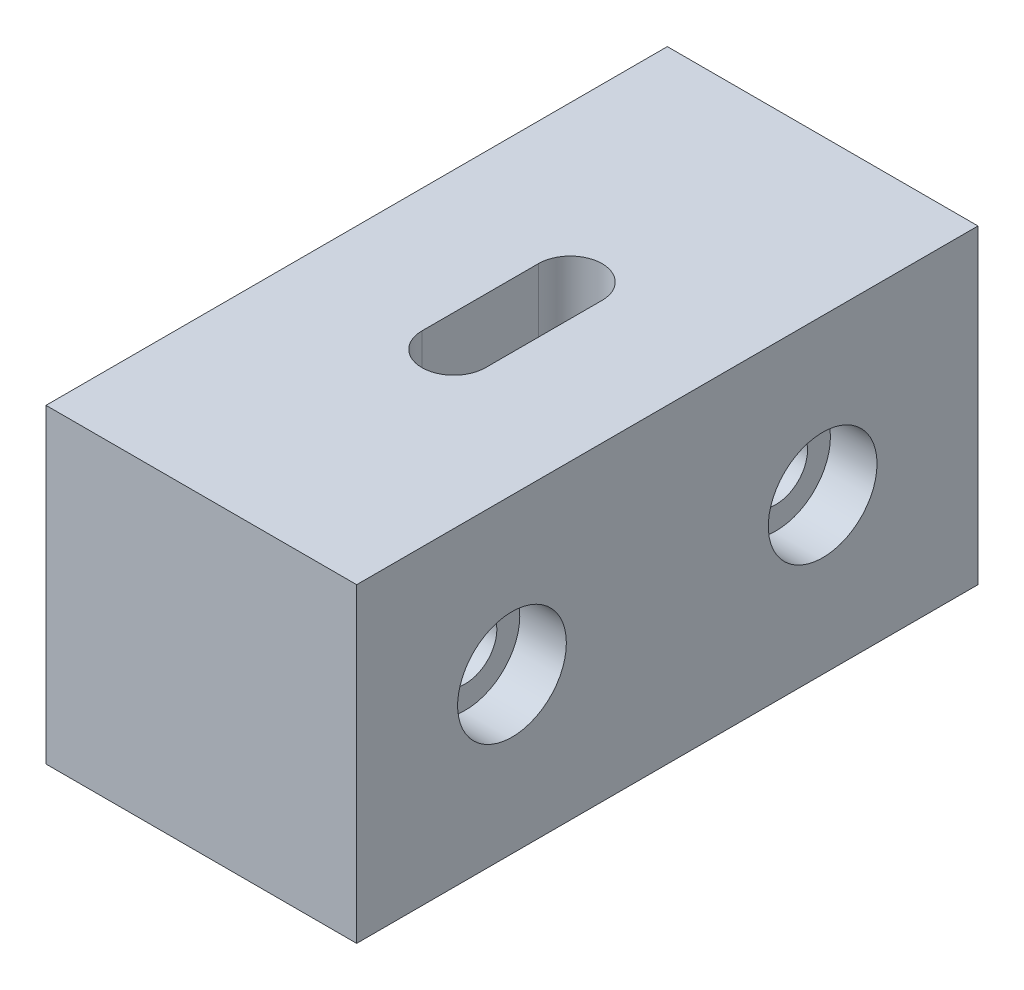
ISO-10303-21;
HEADER;
FILE_DESCRIPTION(('STEP AP214'),'2;1');
FILE_NAME('part.step','',(''),(''),'','','');
FILE_SCHEMA(('AUTOMOTIVE_DESIGN { 1 0 10303 214 1 1 1 1 }'));
ENDSEC;
DATA;
#1=APPLICATION_CONTEXT('core data for automotive mechanical design processes');
#2=APPLICATION_PROTOCOL_DEFINITION('international standard','automotive_design',2000,#1);
#3=PRODUCT_CONTEXT('',#1,'mechanical');
#4=PRODUCT('Part','Part','',(#3));
#5=PRODUCT_RELATED_PRODUCT_CATEGORY('part','',(#4));
#6=PRODUCT_DEFINITION_FORMATION('','',#4);
#7=PRODUCT_DEFINITION_CONTEXT('part definition',#1,'design');
#8=PRODUCT_DEFINITION('design','',#6,#7);
#9=PRODUCT_DEFINITION_SHAPE('','',#8);
#10=(LENGTH_UNIT() NAMED_UNIT(*) SI_UNIT(.MILLI.,.METRE.));
#11=(NAMED_UNIT(*) PLANE_ANGLE_UNIT() SI_UNIT($,.RADIAN.));
#12=(NAMED_UNIT(*) SI_UNIT($,.STERADIAN.) SOLID_ANGLE_UNIT());
#13=UNCERTAINTY_MEASURE_WITH_UNIT(LENGTH_MEASURE(1.E-05),#10,'distance_accuracy_value','');
#14=(GEOMETRIC_REPRESENTATION_CONTEXT(3) GLOBAL_UNCERTAINTY_ASSIGNED_CONTEXT((#13)) GLOBAL_UNIT_ASSIGNED_CONTEXT((#10,
#11,#12)) REPRESENTATION_CONTEXT('',''));
#15=CARTESIAN_POINT('',(0.,0.,0.));
#16=DIRECTION('',(0.,0.,1.));
#17=DIRECTION('',(1.,0.,0.));
#18=AXIS2_PLACEMENT_3D('',#15,#16,#17);
#19=CARTESIAN_POINT('',(0.,-20.,-40.));
#20=DIRECTION('',(0.,-1.,0.));
#21=DIRECTION('',(0.,0.,-1.));
#22=AXIS2_PLACEMENT_3D('',#19,#20,#21);
#23=PLANE('',#22);
#24=DIRECTION('',(0.,0.,1.));
#25=VECTOR('',#24,1.);
#26=CARTESIAN_POINT('',(20.,-20.,-40.));
#27=LINE('',#26,#25);
#28=CARTESIAN_POINT('',(20.,-20.,-40.));
#29=VERTEX_POINT('',#28);
#30=CARTESIAN_POINT('',(20.,-20.,40.));
#31=VERTEX_POINT('',#30);
#32=EDGE_CURVE('E162',#29,#31,#27,.T.);
#33=ORIENTED_EDGE('',*,*,#32,.T.);
#34=DIRECTION('',(1.,0.,0.));
#35=VECTOR('',#34,1.);
#36=CARTESIAN_POINT('',(0.,-20.,40.));
#37=LINE('',#36,#35);
#38=CARTESIAN_POINT('',(-20.,-20.,40.));
#39=VERTEX_POINT('',#38);
#40=EDGE_CURVE('E140',#39,#31,#37,.T.);
#41=ORIENTED_EDGE('',*,*,#40,.F.);
#42=DIRECTION('',(0.,0.,1.));
#43=VECTOR('',#42,1.);
#44=CARTESIAN_POINT('',(-20.,-20.,-40.));
#45=LINE('',#44,#43);
#46=CARTESIAN_POINT('',(-20.,-20.,-40.));
#47=VERTEX_POINT('',#46);
#48=EDGE_CURVE('E163',#47,#39,#45,.T.);
#49=ORIENTED_EDGE('',*,*,#48,.F.);
#50=DIRECTION('',(1.,0.,0.));
#51=VECTOR('',#50,1.);
#52=CARTESIAN_POINT('',(0.,-20.,-40.));
#53=LINE('',#52,#51);
#54=EDGE_CURVE('E152',#47,#29,#53,.T.);
#55=ORIENTED_EDGE('',*,*,#54,.T.);
#56=EDGE_LOOP('',(#33,#41,#49,#55));
#57=FACE_BOUND('',#56,.T.);
#58=DIRECTION('',(0.,0.,1.));
#59=VECTOR('',#58,1.);
#60=CARTESIAN_POINT('',(-4.10000000000001,-20.,-40.));
#61=LINE('',#60,#59);
#62=CARTESIAN_POINT('',(-4.1,-20.,-7.5));
#63=VERTEX_POINT('',#62);
#64=CARTESIAN_POINT('',(-4.1,-20.,7.5));
#65=VERTEX_POINT('',#64);
#66=EDGE_CURVE('E95',#63,#65,#61,.T.);
#67=ORIENTED_EDGE('',*,*,#66,.T.);
#68=CARTESIAN_POINT('',(0.,-20.,7.5));
#69=DIRECTION('',(0.,-1.,0.));
#70=DIRECTION('',(0.,0.,-1.));
#71=AXIS2_PLACEMENT_3D('',#68,#69,#70);
#72=CIRCLE('',#71,4.1);
#73=CARTESIAN_POINT('',(4.1,-20.,7.5));
#74=VERTEX_POINT('',#73);
#75=EDGE_CURVE('E115',#65,#74,#72,.F.);
#76=ORIENTED_EDGE('',*,*,#75,.T.);
#77=DIRECTION('',(0.,0.,-1.));
#78=VECTOR('',#77,1.);
#79=CARTESIAN_POINT('',(4.09999999999999,-20.,-40.));
#80=LINE('',#79,#78);
#81=CARTESIAN_POINT('',(4.1,-20.,-7.5));
#82=VERTEX_POINT('',#81);
#83=EDGE_CURVE('E113',#74,#82,#80,.T.);
#84=ORIENTED_EDGE('',*,*,#83,.T.);
#85=CARTESIAN_POINT('',(0.,-20.,-7.5));
#86=DIRECTION('',(0.,-1.,0.));
#87=DIRECTION('',(0.,0.,-1.));
#88=AXIS2_PLACEMENT_3D('',#85,#86,#87);
#89=CIRCLE('',#88,4.1);
#90=EDGE_CURVE('E100',#82,#63,#89,.F.);
#91=ORIENTED_EDGE('',*,*,#90,.T.);
#92=EDGE_LOOP('',(#67,#76,#84,#91));
#93=FACE_BOUND('',#92,.T.);
#94=ADVANCED_FACE('F35',(#57,#93),#23,.T.);
#95=CARTESIAN_POINT('',(0.,20.,-40.));
#96=DIRECTION('',(0.,-1.,0.));
#97=DIRECTION('',(0.,0.,-1.));
#98=AXIS2_PLACEMENT_3D('',#95,#96,#97);
#99=PLANE('',#98);
#100=DIRECTION('',(0.,0.,1.));
#101=VECTOR('',#100,1.);
#102=CARTESIAN_POINT('',(-20.,20.,-40.));
#103=LINE('',#102,#101);
#104=CARTESIAN_POINT('',(-20.,20.,-40.));
#105=VERTEX_POINT('',#104);
#106=CARTESIAN_POINT('',(-20.,20.,40.));
#107=VERTEX_POINT('',#106);
#108=EDGE_CURVE('E166',#105,#107,#103,.T.);
#109=ORIENTED_EDGE('',*,*,#108,.T.);
#110=DIRECTION('',(1.,0.,0.));
#111=VECTOR('',#110,1.);
#112=CARTESIAN_POINT('',(0.,20.,40.));
#113=LINE('',#112,#111);
#114=CARTESIAN_POINT('',(20.,20.,40.));
#115=VERTEX_POINT('',#114);
#116=EDGE_CURVE('E146',#107,#115,#113,.T.);
#117=ORIENTED_EDGE('',*,*,#116,.T.);
#118=DIRECTION('',(0.,0.,1.));
#119=VECTOR('',#118,1.);
#120=CARTESIAN_POINT('',(20.,20.,-40.));
#121=LINE('',#120,#119);
#122=CARTESIAN_POINT('',(20.,20.,-40.));
#123=VERTEX_POINT('',#122);
#124=EDGE_CURVE('E168',#123,#115,#121,.T.);
#125=ORIENTED_EDGE('',*,*,#124,.F.);
#126=DIRECTION('',(1.,0.,0.));
#127=VECTOR('',#126,1.);
#128=CARTESIAN_POINT('',(0.,20.,-40.));
#129=LINE('',#128,#127);
#130=EDGE_CURVE('E158',#105,#123,#129,.T.);
#131=ORIENTED_EDGE('',*,*,#130,.F.);
#132=EDGE_LOOP('',(#109,#117,#125,#131));
#133=FACE_BOUND('',#132,.T.);
#134=CARTESIAN_POINT('',(0.,20.,7.5));
#135=DIRECTION('',(0.,-1.,0.));
#136=DIRECTION('',(0.,0.,-1.));
#137=AXIS2_PLACEMENT_3D('',#134,#135,#136);
#138=CIRCLE('',#137,4.1);
#139=CARTESIAN_POINT('',(-4.1,20.,7.5));
#140=VERTEX_POINT('',#139);
#141=CARTESIAN_POINT('',(4.1,20.,7.5));
#142=VERTEX_POINT('',#141);
#143=EDGE_CURVE('E11',#140,#142,#138,.F.);
#144=ORIENTED_EDGE('',*,*,#143,.F.);
#145=DIRECTION('',(0.,0.,1.));
#146=VECTOR('',#145,1.);
#147=CARTESIAN_POINT('',(-4.10000000000001,20.,-40.));
#148=LINE('',#147,#146);
#149=CARTESIAN_POINT('',(-4.1,20.,-7.5));
#150=VERTEX_POINT('',#149);
#151=EDGE_CURVE('E165',#150,#140,#148,.T.);
#152=ORIENTED_EDGE('',*,*,#151,.F.);
#153=CARTESIAN_POINT('',(0.,20.,-7.5));
#154=DIRECTION('',(0.,-1.,0.));
#155=DIRECTION('',(0.,0.,-1.));
#156=AXIS2_PLACEMENT_3D('',#153,#154,#155);
#157=CIRCLE('',#156,4.1);
#158=CARTESIAN_POINT('',(4.1,20.,-7.5));
#159=VERTEX_POINT('',#158);
#160=EDGE_CURVE('E108',#159,#150,#157,.F.);
#161=ORIENTED_EDGE('',*,*,#160,.F.);
#162=DIRECTION('',(0.,0.,-1.));
#163=VECTOR('',#162,1.);
#164=CARTESIAN_POINT('',(4.09999999999999,20.,-40.));
#165=LINE('',#164,#163);
#166=EDGE_CURVE('E42',#142,#159,#165,.T.);
#167=ORIENTED_EDGE('',*,*,#166,.F.);
#168=EDGE_LOOP('',(#144,#152,#161,#167));
#169=FACE_BOUND('',#168,.T.);
#170=ADVANCED_FACE('F184',(#133,#169),#99,.F.);
#171=CARTESIAN_POINT('',(80.,0.,-20.));
#172=DIRECTION('',(-1.,0.,0.));
#173=DIRECTION('',(0.,0.,1.));
#174=AXIS2_PLACEMENT_3D('',#171,#172,#173);
#175=CYLINDRICAL_SURFACE('',#174,4.05);
#176=CARTESIAN_POINT('',(-20.,0.,-20.));
#177=DIRECTION('',(1.,0.,0.));
#178=DIRECTION('',(0.,0.,-1.));
#179=AXIS2_PLACEMENT_3D('',#176,#177,#178);
#180=CIRCLE('',#179,4.05);
#181=CARTESIAN_POINT('',(-20.,0.,-24.05));
#182=VERTEX_POINT('',#181);
#183=EDGE_CURVE('E133',#182,#182,#180,.F.);
#184=ORIENTED_EDGE('',*,*,#183,.T.);
#185=EDGE_LOOP('',(#184));
#186=FACE_BOUND('',#185,.T.);
#187=CARTESIAN_POINT('',(14.,0.,-20.));
#188=DIRECTION('',(1.,0.,0.));
#189=DIRECTION('',(0.,0.,-1.));
#190=AXIS2_PLACEMENT_3D('',#187,#188,#189);
#191=CIRCLE('',#190,4.05);
#192=CARTESIAN_POINT('',(14.,0.,-24.05));
#193=VERTEX_POINT('',#192);
#194=EDGE_CURVE('E137',#193,#193,#191,.T.);
#195=ORIENTED_EDGE('',*,*,#194,.T.);
#196=EDGE_LOOP('',(#195));
#197=FACE_BOUND('',#196,.T.);
#198=ADVANCED_FACE('F205',(#186,#197),#175,.F.);
#199=CARTESIAN_POINT('',(80.,0.,20.));
#200=DIRECTION('',(-1.,0.,0.));
#201=DIRECTION('',(0.,0.,1.));
#202=AXIS2_PLACEMENT_3D('',#199,#200,#201);
#203=CYLINDRICAL_SURFACE('',#202,4.05);
#204=CARTESIAN_POINT('',(-20.,0.,20.));
#205=DIRECTION('',(1.,0.,0.));
#206=DIRECTION('',(0.,0.,-1.));
#207=AXIS2_PLACEMENT_3D('',#204,#205,#206);
#208=CIRCLE('',#207,4.05);
#209=CARTESIAN_POINT('',(-20.,0.,15.95));
#210=VERTEX_POINT('',#209);
#211=EDGE_CURVE('E136',#210,#210,#208,.F.);
#212=ORIENTED_EDGE('',*,*,#211,.T.);
#213=EDGE_LOOP('',(#212));
#214=FACE_BOUND('',#213,.T.);
#215=CARTESIAN_POINT('',(14.,0.,20.));
#216=DIRECTION('',(1.,0.,0.));
#217=DIRECTION('',(0.,0.,-1.));
#218=AXIS2_PLACEMENT_3D('',#215,#216,#217);
#219=CIRCLE('',#218,4.05);
#220=CARTESIAN_POINT('',(14.,0.,15.95));
#221=VERTEX_POINT('',#220);
#222=EDGE_CURVE('E124',#221,#221,#219,.T.);
#223=ORIENTED_EDGE('',*,*,#222,.T.);
#224=EDGE_LOOP('',(#223));
#225=FACE_BOUND('',#224,.T.);
#226=ADVANCED_FACE('F238',(#214,#225),#203,.F.);
#227=CARTESIAN_POINT('',(-20.,0.,-40.));
#228=DIRECTION('',(1.,0.,0.));
#229=DIRECTION('',(0.,0.,-1.));
#230=AXIS2_PLACEMENT_3D('',#227,#228,#229);
#231=PLANE('',#230);
#232=ORIENTED_EDGE('',*,*,#211,.F.);
#233=EDGE_LOOP('',(#232));
#234=FACE_BOUND('',#233,.T.);
#235=ORIENTED_EDGE('',*,*,#183,.F.);
#236=EDGE_LOOP('',(#235));
#237=FACE_BOUND('',#236,.T.);
#238=ORIENTED_EDGE('',*,*,#48,.T.);
#239=DIRECTION('',(0.,1.,0.));
#240=VECTOR('',#239,1.);
#241=CARTESIAN_POINT('',(-20.,0.,40.));
#242=LINE('',#241,#240);
#243=EDGE_CURVE('E149',#39,#107,#242,.T.);
#244=ORIENTED_EDGE('',*,*,#243,.T.);
#245=ORIENTED_EDGE('',*,*,#108,.F.);
#246=DIRECTION('',(0.,1.,0.));
#247=VECTOR('',#246,1.);
#248=CARTESIAN_POINT('',(-20.,0.,-40.));
#249=LINE('',#248,#247);
#250=EDGE_CURVE('E160',#47,#105,#249,.T.);
#251=ORIENTED_EDGE('',*,*,#250,.F.);
#252=EDGE_LOOP('',(#238,#244,#245,#251));
#253=FACE_BOUND('',#252,.T.);
#254=ADVANCED_FACE('F221',(#234,#237,#253),#231,.F.);
#255=CARTESIAN_POINT('',(20.,0.,-40.));
#256=DIRECTION('',(1.,0.,0.));
#257=DIRECTION('',(0.,0.,-1.));
#258=AXIS2_PLACEMENT_3D('',#255,#256,#257);
#259=PLANE('',#258);
#260=CARTESIAN_POINT('',(20.,0.,20.));
#261=DIRECTION('',(1.,0.,0.));
#262=DIRECTION('',(0.,0.,-1.));
#263=AXIS2_PLACEMENT_3D('',#260,#261,#262);
#264=CIRCLE('',#263,7.);
#265=CARTESIAN_POINT('',(20.,0.,13.));
#266=VERTEX_POINT('',#265);
#267=EDGE_CURVE('E125',#266,#266,#264,.T.);
#268=ORIENTED_EDGE('',*,*,#267,.F.);
#269=EDGE_LOOP('',(#268));
#270=FACE_BOUND('',#269,.T.);
#271=CARTESIAN_POINT('',(20.,0.,-20.));
#272=DIRECTION('',(1.,0.,0.));
#273=DIRECTION('',(0.,0.,-1.));
#274=AXIS2_PLACEMENT_3D('',#271,#272,#273);
#275=CIRCLE('',#274,7.);
#276=CARTESIAN_POINT('',(20.,0.,-27.));
#277=VERTEX_POINT('',#276);
#278=EDGE_CURVE('E120',#277,#277,#275,.T.);
#279=ORIENTED_EDGE('',*,*,#278,.F.);
#280=EDGE_LOOP('',(#279));
#281=FACE_BOUND('',#280,.T.);
#282=ORIENTED_EDGE('',*,*,#124,.T.);
#283=DIRECTION('',(0.,1.,0.));
#284=VECTOR('',#283,1.);
#285=CARTESIAN_POINT('',(20.,0.,40.));
#286=LINE('',#285,#284);
#287=EDGE_CURVE('E143',#31,#115,#286,.T.);
#288=ORIENTED_EDGE('',*,*,#287,.F.);
#289=ORIENTED_EDGE('',*,*,#32,.F.);
#290=DIRECTION('',(0.,1.,0.));
#291=VECTOR('',#290,1.);
#292=CARTESIAN_POINT('',(20.,0.,-40.));
#293=LINE('',#292,#291);
#294=EDGE_CURVE('E155',#29,#123,#293,.T.);
#295=ORIENTED_EDGE('',*,*,#294,.T.);
#296=EDGE_LOOP('',(#282,#288,#289,#295));
#297=FACE_BOUND('',#296,.T.);
#298=ADVANCED_FACE('F214',(#270,#281,#297),#259,.T.);
#299=CARTESIAN_POINT('',(0.,0.,-40.));
#300=DIRECTION('',(0.,0.,1.));
#301=DIRECTION('',(1.,0.,0.));
#302=AXIS2_PLACEMENT_3D('',#299,#300,#301);
#303=PLANE('',#302);
#304=ORIENTED_EDGE('',*,*,#54,.F.);
#305=ORIENTED_EDGE('',*,*,#250,.T.);
#306=ORIENTED_EDGE('',*,*,#130,.T.);
#307=ORIENTED_EDGE('',*,*,#294,.F.);
#308=EDGE_LOOP('',(#304,#305,#306,#307));
#309=FACE_BOUND('',#308,.T.);
#310=ADVANCED_FACE('F225',(#309),#303,.F.);
#311=CARTESIAN_POINT('',(0.,0.,40.));
#312=DIRECTION('',(0.,0.,1.));
#313=DIRECTION('',(1.,0.,0.));
#314=AXIS2_PLACEMENT_3D('',#311,#312,#313);
#315=PLANE('',#314);
#316=ORIENTED_EDGE('',*,*,#40,.T.);
#317=ORIENTED_EDGE('',*,*,#287,.T.);
#318=ORIENTED_EDGE('',*,*,#116,.F.);
#319=ORIENTED_EDGE('',*,*,#243,.F.);
#320=EDGE_LOOP('',(#316,#317,#318,#319));
#321=FACE_BOUND('',#320,.T.);
#322=ADVANCED_FACE('F218',(#321),#315,.T.);
#323=CARTESIAN_POINT('',(14.,0.,20.));
#324=DIRECTION('',(1.,0.,0.));
#325=DIRECTION('',(0.,0.,-1.));
#326=AXIS2_PLACEMENT_3D('',#323,#324,#325);
#327=CYLINDRICAL_SURFACE('',#326,7.);
#328=CARTESIAN_POINT('',(14.,0.,20.));
#329=DIRECTION('',(1.,0.,0.));
#330=DIRECTION('',(0.,0.,-1.));
#331=AXIS2_PLACEMENT_3D('',#328,#329,#330);
#332=CIRCLE('',#331,7.);
#333=CARTESIAN_POINT('',(14.,0.,13.));
#334=VERTEX_POINT('',#333);
#335=EDGE_CURVE('E121',#334,#334,#332,.T.);
#336=ORIENTED_EDGE('',*,*,#335,.F.);
#337=EDGE_LOOP('',(#336));
#338=FACE_BOUND('',#337,.T.);
#339=ORIENTED_EDGE('',*,*,#267,.T.);
#340=EDGE_LOOP('',(#339));
#341=FACE_BOUND('',#340,.T.);
#342=ADVANCED_FACE('F232',(#338,#341),#327,.F.);
#343=CARTESIAN_POINT('',(14.,0.,20.));
#344=DIRECTION('',(1.,0.,0.));
#345=DIRECTION('',(0.,0.,-1.));
#346=AXIS2_PLACEMENT_3D('',#343,#344,#345);
#347=PLANE('',#346);
#348=ORIENTED_EDGE('',*,*,#222,.F.);
#349=EDGE_LOOP('',(#348));
#350=FACE_BOUND('',#349,.T.);
#351=ORIENTED_EDGE('',*,*,#335,.T.);
#352=EDGE_LOOP('',(#351));
#353=FACE_BOUND('',#352,.T.);
#354=ADVANCED_FACE('F257',(#350,#353),#347,.T.);
#355=CARTESIAN_POINT('',(14.,0.,-20.));
#356=DIRECTION('',(1.,0.,0.));
#357=DIRECTION('',(0.,0.,-1.));
#358=AXIS2_PLACEMENT_3D('',#355,#356,#357);
#359=CYLINDRICAL_SURFACE('',#358,7.);
#360=CARTESIAN_POINT('',(14.,0.,-20.));
#361=DIRECTION('',(1.,0.,0.));
#362=DIRECTION('',(0.,0.,-1.));
#363=AXIS2_PLACEMENT_3D('',#360,#361,#362);
#364=CIRCLE('',#363,7.);
#365=CARTESIAN_POINT('',(14.,0.,-27.));
#366=VERTEX_POINT('',#365);
#367=EDGE_CURVE('E128',#366,#366,#364,.T.);
#368=ORIENTED_EDGE('',*,*,#367,.F.);
#369=EDGE_LOOP('',(#368));
#370=FACE_BOUND('',#369,.T.);
#371=ORIENTED_EDGE('',*,*,#278,.T.);
#372=EDGE_LOOP('',(#371));
#373=FACE_BOUND('',#372,.T.);
#374=ADVANCED_FACE('F196',(#370,#373),#359,.F.);
#375=CARTESIAN_POINT('',(14.,0.,-20.));
#376=DIRECTION('',(1.,0.,0.));
#377=DIRECTION('',(0.,0.,-1.));
#378=AXIS2_PLACEMENT_3D('',#375,#376,#377);
#379=PLANE('',#378);
#380=ORIENTED_EDGE('',*,*,#194,.F.);
#381=EDGE_LOOP('',(#380));
#382=FACE_BOUND('',#381,.T.);
#383=ORIENTED_EDGE('',*,*,#367,.T.);
#384=EDGE_LOOP('',(#383));
#385=FACE_BOUND('',#384,.T.);
#386=ADVANCED_FACE('F189',(#382,#385),#379,.T.);
#387=CARTESIAN_POINT('',(0.,36.,7.5));
#388=DIRECTION('',(0.,-1.,0.));
#389=DIRECTION('',(0.,0.,-1.));
#390=AXIS2_PLACEMENT_3D('',#387,#388,#389);
#391=CYLINDRICAL_SURFACE('',#390,4.1);
#392=DIRECTION('',(0.,-1.,0.));
#393=VECTOR('',#392,1.);
#394=CARTESIAN_POINT('',(-4.1,36.,7.5));
#395=LINE('',#394,#393);
#396=EDGE_CURVE('E49',#140,#65,#395,.T.);
#397=ORIENTED_EDGE('',*,*,#396,.F.);
#398=ORIENTED_EDGE('',*,*,#143,.T.);
#399=DIRECTION('',(0.,-1.,0.));
#400=VECTOR('',#399,1.);
#401=CARTESIAN_POINT('',(4.1,36.,7.5));
#402=LINE('',#401,#400);
#403=EDGE_CURVE('E101',#142,#74,#402,.T.);
#404=ORIENTED_EDGE('',*,*,#403,.T.);
#405=ORIENTED_EDGE('',*,*,#75,.F.);
#406=EDGE_LOOP('',(#397,#398,#404,#405));
#407=FACE_BOUND('',#406,.T.);
#408=ADVANCED_FACE('F186',(#407),#391,.F.);
#409=CARTESIAN_POINT('',(4.1,36.,7.5));
#410=DIRECTION('',(-1.,0.,0.));
#411=DIRECTION('',(0.,0.,1.));
#412=AXIS2_PLACEMENT_3D('',#409,#410,#411);
#413=PLANE('',#412);
#414=ORIENTED_EDGE('',*,*,#403,.F.);
#415=ORIENTED_EDGE('',*,*,#166,.T.);
#416=DIRECTION('',(0.,-1.,0.));
#417=VECTOR('',#416,1.);
#418=CARTESIAN_POINT('',(4.1,36.,-7.5));
#419=LINE('',#418,#417);
#420=EDGE_CURVE('E110',#159,#82,#419,.T.);
#421=ORIENTED_EDGE('',*,*,#420,.T.);
#422=ORIENTED_EDGE('',*,*,#83,.F.);
#423=EDGE_LOOP('',(#414,#415,#421,#422));
#424=FACE_BOUND('',#423,.T.);
#425=ADVANCED_FACE('F179',(#424),#413,.T.);
#426=CARTESIAN_POINT('',(0.,36.,-7.5));
#427=DIRECTION('',(0.,-1.,0.));
#428=DIRECTION('',(0.,0.,-1.));
#429=AXIS2_PLACEMENT_3D('',#426,#427,#428);
#430=CYLINDRICAL_SURFACE('',#429,4.1);
#431=ORIENTED_EDGE('',*,*,#420,.F.);
#432=ORIENTED_EDGE('',*,*,#160,.T.);
#433=DIRECTION('',(0.,-1.,0.));
#434=VECTOR('',#433,1.);
#435=CARTESIAN_POINT('',(-4.1,36.,-7.5));
#436=LINE('',#435,#434);
#437=EDGE_CURVE('E54',#150,#63,#436,.T.);
#438=ORIENTED_EDGE('',*,*,#437,.T.);
#439=ORIENTED_EDGE('',*,*,#90,.F.);
#440=EDGE_LOOP('',(#431,#432,#438,#439));
#441=FACE_BOUND('',#440,.T.);
#442=ADVANCED_FACE('F105',(#441),#430,.F.);
#443=CARTESIAN_POINT('',(-4.1,36.,7.5));
#444=DIRECTION('',(1.,0.,0.));
#445=DIRECTION('',(0.,0.,-1.));
#446=AXIS2_PLACEMENT_3D('',#443,#444,#445);
#447=PLANE('',#446);
#448=ORIENTED_EDGE('',*,*,#437,.F.);
#449=ORIENTED_EDGE('',*,*,#151,.T.);
#450=ORIENTED_EDGE('',*,*,#396,.T.);
#451=ORIENTED_EDGE('',*,*,#66,.F.);
#452=EDGE_LOOP('',(#448,#449,#450,#451));
#453=FACE_BOUND('',#452,.T.);
#454=ADVANCED_FACE('F96',(#453),#447,.T.);
#455=CLOSED_SHELL('',(#94,#170,#198,#226,#254,#298,#310,#322,#342,#354,#374,#386,#408,#425,#442,#454));
#456=MANIFOLD_SOLID_BREP('B2',#455);
#457=ADVANCED_BREP_SHAPE_REPRESENTATION('',(#18,#456),#14);
#458=SHAPE_DEFINITION_REPRESENTATION(#9,#457);
ENDSEC;
END-ISO-10303-21;
